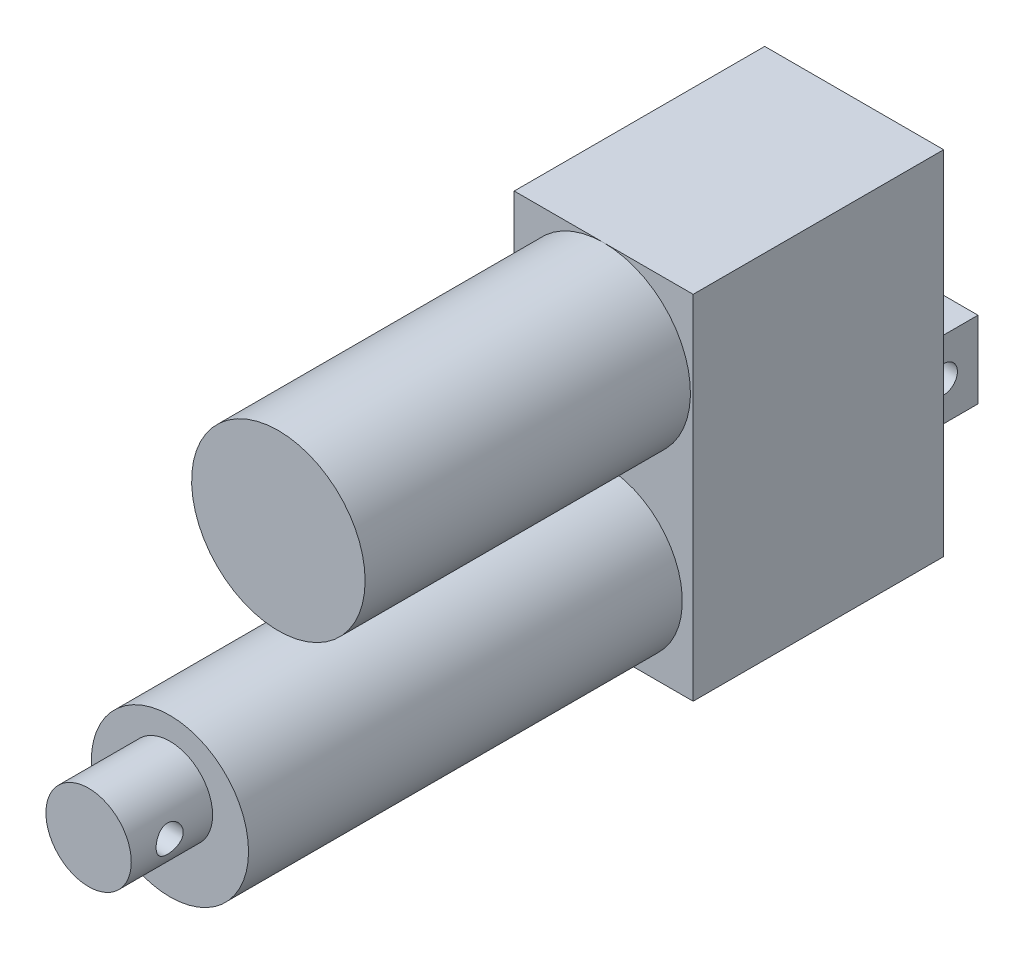
ISO-10303-21;
HEADER;
FILE_DESCRIPTION(('STEP AP214'),'2;1');
FILE_NAME('part.step','',(''),(''),'','','');
FILE_SCHEMA(('AUTOMOTIVE_DESIGN { 1 0 10303 214 1 1 1 1 }'));
ENDSEC;
DATA;
#1=APPLICATION_CONTEXT('core data for automotive mechanical design processes');
#2=APPLICATION_PROTOCOL_DEFINITION('international standard','automotive_design',2000,#1);
#3=PRODUCT_CONTEXT('',#1,'mechanical');
#4=PRODUCT('Part','Part','',(#3));
#5=PRODUCT_RELATED_PRODUCT_CATEGORY('part','',(#4));
#6=PRODUCT_DEFINITION_FORMATION('','',#4);
#7=PRODUCT_DEFINITION_CONTEXT('part definition',#1,'design');
#8=PRODUCT_DEFINITION('design','',#6,#7);
#9=PRODUCT_DEFINITION_SHAPE('','',#8);
#10=(LENGTH_UNIT() NAMED_UNIT(*) SI_UNIT(.MILLI.,.METRE.));
#11=(NAMED_UNIT(*) PLANE_ANGLE_UNIT() SI_UNIT($,.RADIAN.));
#12=(NAMED_UNIT(*) SI_UNIT($,.STERADIAN.) SOLID_ANGLE_UNIT());
#13=UNCERTAINTY_MEASURE_WITH_UNIT(LENGTH_MEASURE(1.E-05),#10,'distance_accuracy_value','');
#14=(GEOMETRIC_REPRESENTATION_CONTEXT(3) GLOBAL_UNCERTAINTY_ASSIGNED_CONTEXT((#13)) GLOBAL_UNIT_ASSIGNED_CONTEXT((#10,
#11,#12)) REPRESENTATION_CONTEXT('',''));
#15=CARTESIAN_POINT('',(0.,0.,0.));
#16=DIRECTION('',(0.,0.,1.));
#17=DIRECTION('',(1.,0.,0.));
#18=AXIS2_PLACEMENT_3D('',#15,#16,#17);
#19=CARTESIAN_POINT('',(0.,0.,0.));
#20=DIRECTION('',(0.,0.,-1.));
#21=DIRECTION('',(-1.,0.,0.));
#22=AXIS2_PLACEMENT_3D('',#19,#20,#21);
#23=PLANE('',#22);
#24=DIRECTION('',(0.,-1.,0.));
#25=VECTOR('',#24,1.);
#26=CARTESIAN_POINT('',(-20.955,0.,0.));
#27=LINE('',#26,#25);
#28=CARTESIAN_POINT('',(-20.955,82.55,0.));
#29=VERTEX_POINT('',#28);
#30=CARTESIAN_POINT('',(-20.955,0.,0.));
#31=VERTEX_POINT('',#30);
#32=EDGE_CURVE('E172',#29,#31,#27,.T.);
#33=ORIENTED_EDGE('',*,*,#32,.F.);
#34=DIRECTION('',(-1.,0.,0.));
#35=VECTOR('',#34,1.);
#36=CARTESIAN_POINT('',(-20.955,82.55,0.));
#37=LINE('',#36,#35);
#38=CARTESIAN_POINT('',(20.955,82.55,0.));
#39=VERTEX_POINT('',#38);
#40=EDGE_CURVE('E88',#39,#29,#37,.T.);
#41=ORIENTED_EDGE('',*,*,#40,.F.);
#42=DIRECTION('',(0.,1.,0.));
#43=VECTOR('',#42,1.);
#44=CARTESIAN_POINT('',(20.955,0.,0.));
#45=LINE('',#44,#43);
#46=CARTESIAN_POINT('',(20.955,0.,0.));
#47=VERTEX_POINT('',#46);
#48=EDGE_CURVE('E194',#47,#39,#45,.T.);
#49=ORIENTED_EDGE('',*,*,#48,.F.);
#50=DIRECTION('',(1.,0.,0.));
#51=VECTOR('',#50,1.);
#52=CARTESIAN_POINT('',(-20.955,0.,0.));
#53=LINE('',#52,#51);
#54=EDGE_CURVE('E191',#31,#47,#53,.T.);
#55=ORIENTED_EDGE('',*,*,#54,.F.);
#56=EDGE_LOOP('',(#33,#41,#49,#55));
#57=FACE_BOUND('',#56,.T.);
#58=DIRECTION('',(-1.,0.,0.));
#59=VECTOR('',#58,1.);
#60=CARTESIAN_POINT('',(9.,15.,0.));
#61=LINE('',#60,#59);
#62=CARTESIAN_POINT('',(9.,15.,0.));
#63=VERTEX_POINT('',#62);
#64=CARTESIAN_POINT('',(-9.,15.,0.));
#65=VERTEX_POINT('',#64);
#66=EDGE_CURVE('E388',#63,#65,#61,.T.);
#67=ORIENTED_EDGE('',*,*,#66,.F.);
#68=DIRECTION('',(0.,-1.,0.));
#69=VECTOR('',#68,1.);
#70=CARTESIAN_POINT('',(9.,15.,0.));
#71=LINE('',#70,#69);
#72=CARTESIAN_POINT('',(9.,33.,0.));
#73=VERTEX_POINT('',#72);
#74=EDGE_CURVE('E146',#73,#63,#71,.T.);
#75=ORIENTED_EDGE('',*,*,#74,.F.);
#76=DIRECTION('',(1.,0.,0.));
#77=VECTOR('',#76,1.);
#78=CARTESIAN_POINT('',(9.,33.,0.));
#79=LINE('',#78,#77);
#80=CARTESIAN_POINT('',(-9.,33.,0.));
#81=VERTEX_POINT('',#80);
#82=EDGE_CURVE('E142',#81,#73,#79,.T.);
#83=ORIENTED_EDGE('',*,*,#82,.F.);
#84=DIRECTION('',(0.,1.,0.));
#85=VECTOR('',#84,1.);
#86=CARTESIAN_POINT('',(-9.,15.,0.));
#87=LINE('',#86,#85);
#88=EDGE_CURVE('E398',#65,#81,#87,.T.);
#89=ORIENTED_EDGE('',*,*,#88,.F.);
#90=EDGE_LOOP('',(#67,#75,#83,#89));
#91=FACE_BOUND('',#90,.T.);
#92=ADVANCED_FACE('F39',(#57,#91),#23,.T.);
#93=CARTESIAN_POINT('',(0.,22.225,179.324));
#94=DIRECTION('',(0.,0.,-1.));
#95=DIRECTION('',(-1.,0.,0.));
#96=AXIS2_PLACEMENT_3D('',#93,#94,#95);
#97=CYLINDRICAL_SURFACE('',#96,9.9949);
#98=CARTESIAN_POINT('',(0.,22.225,179.324));
#99=DIRECTION('',(0.,0.,1.));
#100=DIRECTION('',(1.,0.,0.));
#101=AXIS2_PLACEMENT_3D('',#98,#99,#100);
#102=CIRCLE('',#101,9.9949);
#103=CARTESIAN_POINT('',(9.9949,22.225,179.324));
#104=VERTEX_POINT('',#103);
#105=EDGE_CURVE('E159',#104,#104,#102,.T.);
#106=ORIENTED_EDGE('',*,*,#105,.F.);
#107=EDGE_LOOP('',(#106));
#108=FACE_BOUND('',#107,.T.);
#109=CARTESIAN_POINT('',(0.,22.225,160.274));
#110=DIRECTION('',(0.,0.,1.));
#111=DIRECTION('',(1.,0.,0.));
#112=AXIS2_PLACEMENT_3D('',#109,#110,#111);
#113=CIRCLE('',#112,9.9949);
#114=CARTESIAN_POINT('',(9.9949,22.225,160.274));
#115=VERTEX_POINT('',#114);
#116=EDGE_CURVE('E11',#115,#115,#113,.T.);
#117=ORIENTED_EDGE('',*,*,#116,.T.);
#118=EDGE_LOOP('',(#117));
#119=FACE_BOUND('',#118,.T.);
#120=CARTESIAN_POINT('',(9.9949,22.225,173.499));
#121=CARTESIAN_POINT('',(9.99489943148129,22.0513092565541,173.498999308142));
#122=CARTESIAN_POINT('',(9.99032991919589,21.8776106581891,173.484700347904));
#123=CARTESIAN_POINT('',(9.97254948420157,21.5353020847592,173.428038276044));
#124=CARTESIAN_POINT('',(9.95933686556654,21.366693115161,173.385669656652));
#125=CARTESIAN_POINT('',(9.92571173869561,21.0395490634003,173.274447608853));
#126=CARTESIAN_POINT('',(9.9053105975343,20.8809985404042,173.205635978803));
#127=CARTESIAN_POINT('',(9.85940898949097,20.5776867487244,173.043661755274));
#128=CARTESIAN_POINT('',(9.83390766824858,20.4329277963521,172.950495081136));
#129=CARTESIAN_POINT('',(9.77959994972423,20.1567043589147,172.739338335955));
#130=CARTESIAN_POINT('',(9.75071977661289,20.0257397862073,172.620713363377));
#131=CARTESIAN_POINT('',(9.69333136472951,19.7851892652354,172.363358676787));
#132=CARTESIAN_POINT('',(9.66482319915058,19.6756074666071,172.224625069491));
#133=CARTESIAN_POINT('',(9.61061015099939,19.4781880893728,171.926621763452));
#134=CARTESIAN_POINT('',(9.5849960523083,19.3909811386147,171.766916201589));
#135=CARTESIAN_POINT('',(9.54058383031433,19.2448724733884,171.434160724684));
#136=CARTESIAN_POINT('',(9.52178384371333,19.1859630196209,171.261114473333));
#137=CARTESIAN_POINT('',(9.49390138743546,19.0999620328589,170.912241952035));
#138=CARTESIAN_POINT('',(9.48453576169181,19.0719408227374,170.736668128251));
#139=CARTESIAN_POINT('',(9.47574247746716,19.0456067989369,170.383080625228));
#140=CARTESIAN_POINT('',(9.47631207537939,19.0472857835666,170.205067633132));
#141=CARTESIAN_POINT('',(9.48707537595335,19.0795786493489,169.859401861761));
#142=CARTESIAN_POINT('',(9.49687349324131,19.1090032583698,169.691623570946));
#143=CARTESIAN_POINT('',(9.52434606300262,19.1940210056623,169.363520722026));
#144=CARTESIAN_POINT('',(9.54202137801414,19.2496170096894,169.203196982303));
#145=CARTESIAN_POINT('',(9.58355473647211,19.3862241866953,168.891753069181));
#146=CARTESIAN_POINT('',(9.6075014418426,19.4676036493509,168.740806769172));
#147=CARTESIAN_POINT('',(9.65883961396201,19.6532119521148,168.454325776801));
#148=CARTESIAN_POINT('',(9.68623199955546,19.7574468925241,168.318795213712));
#149=CARTESIAN_POINT('',(9.74295467384294,19.991613078832,168.06027909095));
#150=CARTESIAN_POINT('',(9.77231545128488,20.1225238524278,167.938185808921));
#151=CARTESIAN_POINT('',(9.82853033884383,20.4033267685916,167.717464879223));
#152=CARTESIAN_POINT('',(9.85538425058315,20.5532204111372,167.618839087669));
#153=CARTESIAN_POINT('',(9.90385804044438,20.8694954466435,167.447221043123));
#154=CARTESIAN_POINT('',(9.92543270832616,21.0360031590969,167.374447948131));
#155=CARTESIAN_POINT('',(9.96059040611695,21.3797429795963,167.258212390363));
#156=CARTESIAN_POINT('',(9.97417594671657,21.556971699091,167.214740718594));
#157=CARTESIAN_POINT('',(9.99141776666915,21.9095536655364,167.159876653046));
#158=CARTESIAN_POINT('',(9.99544754891065,22.0847010423518,167.1472768878));
#159=CARTESIAN_POINT('',(9.99423222033593,22.4346298116178,167.151101608856));
#160=CARTESIAN_POINT('',(9.98898851468274,22.6094112554986,167.167521697931));
#161=CARTESIAN_POINT('',(9.97006114580803,22.9489473033509,167.227953940954));
#162=CARTESIAN_POINT('',(9.95659906175966,23.1138442971088,167.271242186709));
#163=CARTESIAN_POINT('',(9.92281793169894,23.4339841156978,167.383293376658));
#164=CARTESIAN_POINT('',(9.90249803083972,23.5892257340996,167.452059496847));
#165=CARTESIAN_POINT('',(9.85645540380041,23.8899454675883,167.615023043681));
#166=CARTESIAN_POINT('',(9.830610853814,24.0350846502555,167.709810532897));
#167=CARTESIAN_POINT('',(9.77646850305318,24.3077990050254,167.921421896696));
#168=CARTESIAN_POINT('',(9.74817001724959,24.435369246776,168.038251935344));
#169=CARTESIAN_POINT('',(9.69084521531567,24.6747613337025,168.296311806585));
#170=CARTESIAN_POINT('',(9.66183667735056,24.7857222355353,168.438346099243));
#171=CARTESIAN_POINT('',(9.60758324297748,24.9823187549957,168.739648133735));
#172=CARTESIAN_POINT('',(9.58233830613342,25.0679546447247,168.898915690383));
#173=CARTESIAN_POINT('',(9.5387440009466,25.2109659471571,169.229920713115));
#174=CARTESIAN_POINT('',(9.52037069133432,25.268439700184,169.401612348826));
#175=CARTESIAN_POINT('',(9.49278210042133,25.353442097597,169.752943612579));
#176=CARTESIAN_POINT('',(9.48356318317802,25.3809826312739,169.932580055465));
#177=CARTESIAN_POINT('',(9.47571459120659,25.4044646008111,170.285677108272));
#178=CARTESIAN_POINT('',(9.47661027899982,25.4018223239037,170.45903411663));
#179=CARTESIAN_POINT('',(9.48773196247542,25.3684488244648,170.802702481114));
#180=CARTESIAN_POINT('',(9.49795749531317,25.3377189953294,170.973013987898));
#181=CARTESIAN_POINT('',(9.52624962207743,25.2500044549944,171.303131460969));
#182=CARTESIAN_POINT('',(9.54419107692458,25.1934378990353,171.463060076378));
#183=CARTESIAN_POINT('',(9.58585794733052,25.0559869327322,171.77128321614));
#184=CARTESIAN_POINT('',(9.60958456686964,24.9750974596025,171.919575310256));
#185=CARTESIAN_POINT('',(9.66133936280518,24.787492070229,172.206777493647));
#186=CARTESIAN_POINT('',(9.68950221367301,24.6798678841986,172.345069933897));
#187=CARTESIAN_POINT('',(9.74635077808078,24.4434310053527,172.602090157918));
#188=CARTESIAN_POINT('',(9.77503663146558,24.3146125693064,172.720812621099));
#189=CARTESIAN_POINT('',(9.830874311614,24.0341540229892,172.939387889396));
#190=CARTESIAN_POINT('',(9.85794031399361,23.8818848505993,173.038457967956));
#191=CARTESIAN_POINT('',(9.90639070684724,23.5619961410756,173.209468516074));
#192=CARTESIAN_POINT('',(9.92777714553556,23.3943821671233,173.281418769757));
#193=CARTESIAN_POINT('',(9.96112964795618,23.0615237977346,173.39144854967));
#194=CARTESIAN_POINT('',(9.97368125683868,22.8970420072601,173.43166111847));
#195=CARTESIAN_POINT('',(9.99056581075465,22.5633752708453,173.485434265252));
#196=CARTESIAN_POINT('',(9.99490055379149,22.3941913620396,173.499000673936));
#197=CARTESIAN_POINT('',(9.9949,22.225,173.499));
#198=B_SPLINE_CURVE_WITH_KNOTS('',3,(#120,#121,#122,#123,#124,#125,#126,#127,#128,#129,#130,
#131,#132,#133,#134,#135,#136,#137,#138,#139,#140,#141,#142,#143,#144,#145,#146,#147,#148,#149,
#150,#151,#152,#153,#154,#155,#156,#157,#158,#159,#160,#161,#162,#163,#164,#165,#166,#167,#168,
#169,#170,#171,#172,#173,#174,#175,#176,#177,#178,#179,#180,#181,#182,#183,#184,#185,#186,#187,
#188,#189,#190,#191,#192,#193,#194,#195,#196,#197),.UNSPECIFIED.,.T.,.F.,(4,2,2,2,2,2,2,2,2,2,2,
2,2,2,2,2,2,2,2,2,2,2,2,2,2,2,2,2,2,2,2,2,2,2,2,2,2,2,4),(0.,0.52045016251978,1.04100247695617,
1.56073531880923,2.0805552971219,2.6152730405478,3.15009445069503,3.69864951197175,
4.24705445917616,4.77846014649094,5.30971908872857,5.81919423976349,6.3287251910694,
6.84588990746844,7.36319282745791,7.90487595100089,8.44660190369042,8.99281634075519,
9.5388590307312,10.0631791987438,10.5874199260755,11.0981149098594,11.6088735767893,
12.1323375728691,12.6559481700261,13.2010430515873,13.7461320762328,14.2893038753472,
14.832259851031,15.3498472079274,15.8674088892094,16.3768756761892,16.8864485815534,
17.4165265584337,17.946748413463,18.4950748080163,19.0432031909209,19.5502822947828,
20.0572504274735),.UNSPECIFIED.);
#199=CARTESIAN_POINT('',(9.9949,22.225,173.499));
#200=VERTEX_POINT('',#199);
#201=EDGE_CURVE('E149',#200,#200,#198,.T.);
#202=ORIENTED_EDGE('',*,*,#201,.F.);
#203=EDGE_LOOP('',(#202));
#204=FACE_BOUND('',#203,.T.);
#205=CARTESIAN_POINT('',(-9.9949,22.225,173.499));
#206=CARTESIAN_POINT('',(-9.99489943148129,22.3986907434459,173.498999308142));
#207=CARTESIAN_POINT('',(-9.99032991919589,22.5723893418109,173.484700347904));
#208=CARTESIAN_POINT('',(-9.97254948420157,22.9146979152408,173.428038276044));
#209=CARTESIAN_POINT('',(-9.95933686556654,23.083306884839,173.385669656652));
#210=CARTESIAN_POINT('',(-9.92571173869561,23.4104509365997,173.274447608853));
#211=CARTESIAN_POINT('',(-9.9053105975343,23.5690014595958,173.205635978803));
#212=CARTESIAN_POINT('',(-9.85940898949097,23.8723132512756,173.043661755274));
#213=CARTESIAN_POINT('',(-9.83390766824858,24.0170722036479,172.950495081136));
#214=CARTESIAN_POINT('',(-9.77959994972423,24.2932956410853,172.739338335955));
#215=CARTESIAN_POINT('',(-9.75071977661289,24.4242602137927,172.620713363377));
#216=CARTESIAN_POINT('',(-9.69333136472951,24.6648107347646,172.363358676787));
#217=CARTESIAN_POINT('',(-9.66482319915058,24.7743925333928,172.224625069491));
#218=CARTESIAN_POINT('',(-9.61061015099939,24.9718119106272,171.926621763452));
#219=CARTESIAN_POINT('',(-9.5849960523083,25.0590188613853,171.766916201589));
#220=CARTESIAN_POINT('',(-9.54058383031433,25.2051275266116,171.434160724684));
#221=CARTESIAN_POINT('',(-9.52178384371333,25.2640369803791,171.261114473333));
#222=CARTESIAN_POINT('',(-9.49390138743546,25.3500379671411,170.912241952035));
#223=CARTESIAN_POINT('',(-9.48453576169181,25.3780591772626,170.736668128251));
#224=CARTESIAN_POINT('',(-9.47574247746716,25.4043932010631,170.383080625228));
#225=CARTESIAN_POINT('',(-9.47631207537939,25.4027142164334,170.205067633132));
#226=CARTESIAN_POINT('',(-9.48707537595335,25.3704213506511,169.859401861761));
#227=CARTESIAN_POINT('',(-9.49687349324131,25.3409967416302,169.691623570946));
#228=CARTESIAN_POINT('',(-9.52434606300262,25.2559789943377,169.363520722026));
#229=CARTESIAN_POINT('',(-9.54202137801414,25.2003829903106,169.203196982303));
#230=CARTESIAN_POINT('',(-9.58355473647211,25.0637758133047,168.891753069181));
#231=CARTESIAN_POINT('',(-9.6075014418426,24.9823963506491,168.740806769172));
#232=CARTESIAN_POINT('',(-9.65883961396201,24.7967880478852,168.454325776801));
#233=CARTESIAN_POINT('',(-9.68623199955546,24.6925531074759,168.318795213712));
#234=CARTESIAN_POINT('',(-9.74295467384294,24.458386921168,168.06027909095));
#235=CARTESIAN_POINT('',(-9.77231545128488,24.3274761475722,167.938185808921));
#236=CARTESIAN_POINT('',(-9.82853033884383,24.0466732314084,167.717464879223));
#237=CARTESIAN_POINT('',(-9.85538425058315,23.8967795888628,167.618839087669));
#238=CARTESIAN_POINT('',(-9.90385804044438,23.5805045533565,167.447221043123));
#239=CARTESIAN_POINT('',(-9.92543270832616,23.4139968409031,167.374447948131));
#240=CARTESIAN_POINT('',(-9.96059040611695,23.0702570204037,167.258212390363));
#241=CARTESIAN_POINT('',(-9.97417594671657,22.893028300909,167.214740718594));
#242=CARTESIAN_POINT('',(-9.99141776666915,22.5404463344636,167.159876653046));
#243=CARTESIAN_POINT('',(-9.99544754891065,22.3652989576482,167.1472768878));
#244=CARTESIAN_POINT('',(-9.99423222033593,22.0153701883822,167.151101608856));
#245=CARTESIAN_POINT('',(-9.98898851468274,21.8405887445014,167.167521697931));
#246=CARTESIAN_POINT('',(-9.97006114580803,21.5010526966491,167.227953940954));
#247=CARTESIAN_POINT('',(-9.95659906175966,21.3361557028912,167.271242186709));
#248=CARTESIAN_POINT('',(-9.92281793169894,21.0160158843022,167.383293376658));
#249=CARTESIAN_POINT('',(-9.90249803083972,20.8607742659004,167.452059496847));
#250=CARTESIAN_POINT('',(-9.85645540380041,20.5600545324117,167.615023043681));
#251=CARTESIAN_POINT('',(-9.830610853814,20.4149153497445,167.709810532897));
#252=CARTESIAN_POINT('',(-9.77646850305318,20.1422009949746,167.921421896696));
#253=CARTESIAN_POINT('',(-9.74817001724959,20.014630753224,168.038251935344));
#254=CARTESIAN_POINT('',(-9.69084521531567,19.7752386662974,168.296311806585));
#255=CARTESIAN_POINT('',(-9.66183667735056,19.6642777644647,168.438346099243));
#256=CARTESIAN_POINT('',(-9.60758324297748,19.4676812450043,168.739648133735));
#257=CARTESIAN_POINT('',(-9.58233830613342,19.3820453552753,168.898915690383));
#258=CARTESIAN_POINT('',(-9.5387440009466,19.2390340528429,169.229920713115));
#259=CARTESIAN_POINT('',(-9.52037069133432,19.181560299816,169.401612348826));
#260=CARTESIAN_POINT('',(-9.49278210042133,19.096557902403,169.752943612579));
#261=CARTESIAN_POINT('',(-9.48356318317802,19.0690173687261,169.932580055465));
#262=CARTESIAN_POINT('',(-9.47571459120659,19.0455353991889,170.285677108272));
#263=CARTESIAN_POINT('',(-9.47661027899982,19.0481776760963,170.45903411663));
#264=CARTESIAN_POINT('',(-9.48773196247542,19.0815511755352,170.802702481114));
#265=CARTESIAN_POINT('',(-9.49795749531317,19.1122810046706,170.973013987898));
#266=CARTESIAN_POINT('',(-9.52624962207743,19.1999955450056,171.303131460969));
#267=CARTESIAN_POINT('',(-9.54419107692458,19.2565621009647,171.463060076378));
#268=CARTESIAN_POINT('',(-9.58585794733052,19.3940130672678,171.77128321614));
#269=CARTESIAN_POINT('',(-9.60958456686964,19.4749025403975,171.919575310256));
#270=CARTESIAN_POINT('',(-9.66133936280517,19.662507929771,172.206777493647));
#271=CARTESIAN_POINT('',(-9.68950221367301,19.7701321158014,172.345069933897));
#272=CARTESIAN_POINT('',(-9.74635077808078,20.0065689946473,172.602090157918));
#273=CARTESIAN_POINT('',(-9.77503663146558,20.1353874306936,172.720812621099));
#274=CARTESIAN_POINT('',(-9.830874311614,20.4158459770108,172.939387889396));
#275=CARTESIAN_POINT('',(-9.85794031399361,20.5681151494007,173.038457967956));
#276=CARTESIAN_POINT('',(-9.90639070684724,20.8880038589243,173.209468516074));
#277=CARTESIAN_POINT('',(-9.92777714553556,21.0556178328767,173.281418769757));
#278=CARTESIAN_POINT('',(-9.96112964795618,21.3884762022654,173.39144854967));
#279=CARTESIAN_POINT('',(-9.97368125683868,21.5529579927399,173.43166111847));
#280=CARTESIAN_POINT('',(-9.99056581075465,21.8866247291547,173.485434265252));
#281=CARTESIAN_POINT('',(-9.99490055379149,22.0558086379604,173.499000673936));
#282=CARTESIAN_POINT('',(-9.9949,22.225,173.499));
#283=B_SPLINE_CURVE_WITH_KNOTS('',3,(#205,#206,#207,#208,#209,#210,#211,#212,#213,#214,#215,
#216,#217,#218,#219,#220,#221,#222,#223,#224,#225,#226,#227,#228,#229,#230,#231,#232,#233,#234,
#235,#236,#237,#238,#239,#240,#241,#242,#243,#244,#245,#246,#247,#248,#249,#250,#251,#252,#253,
#254,#255,#256,#257,#258,#259,#260,#261,#262,#263,#264,#265,#266,#267,#268,#269,#270,#271,#272,
#273,#274,#275,#276,#277,#278,#279,#280,#281,#282),.UNSPECIFIED.,.T.,.F.,(4,2,2,2,2,2,2,2,2,2,2,
2,2,2,2,2,2,2,2,2,2,2,2,2,2,2,2,2,2,2,2,2,2,2,2,2,2,2,4),(0.,0.52045016251978,1.04100247695617,
1.56073531880923,2.0805552971219,2.61527304054781,3.15009445069504,3.69864951197175,
4.24705445917616,4.77846014649094,5.30971908872857,5.81919423976349,6.3287251910694,
6.84588990746844,7.36319282745791,7.90487595100089,8.44660190369042,8.99281634075519,
9.5388590307312,10.0631791987438,10.5874199260755,11.0981149098594,11.6088735767893,
12.1323375728691,12.6559481700261,13.2010430515873,13.7461320762328,14.2893038753472,
14.832259851031,15.3498472079274,15.8674088892094,16.3768756761892,16.8864485815534,
17.4165265584337,17.946748413463,18.4950748080163,19.0432031909209,19.5502822947828,
20.0572504274735),.UNSPECIFIED.);
#284=CARTESIAN_POINT('',(-9.9949,22.225,173.499));
#285=VERTEX_POINT('',#284);
#286=EDGE_CURVE('E154',#285,#285,#283,.T.);
#287=ORIENTED_EDGE('',*,*,#286,.F.);
#288=EDGE_LOOP('',(#287));
#289=FACE_BOUND('',#288,.T.);
#290=ADVANCED_FACE('F221',(#108,#119,#204,#289),#97,.T.);
#291=CARTESIAN_POINT('',(-20.955,0.,58.674));
#292=DIRECTION('',(1.,0.,0.));
#293=DIRECTION('',(0.,0.,-1.));
#294=AXIS2_PLACEMENT_3D('',#291,#292,#293);
#295=PLANE('',#294);
#296=ORIENTED_EDGE('',*,*,#32,.T.);
#297=DIRECTION('',(0.,0.,-1.));
#298=VECTOR('',#297,1.);
#299=CARTESIAN_POINT('',(-20.955,0.,58.674));
#300=LINE('',#299,#298);
#301=CARTESIAN_POINT('',(-20.955,0.,58.674));
#302=VERTEX_POINT('',#301);
#303=EDGE_CURVE('E208',#302,#31,#300,.T.);
#304=ORIENTED_EDGE('',*,*,#303,.F.);
#305=DIRECTION('',(0.,-1.,0.));
#306=VECTOR('',#305,1.);
#307=CARTESIAN_POINT('',(-20.955,0.,58.674));
#308=LINE('',#307,#306);
#309=CARTESIAN_POINT('',(-20.955,82.55,58.674));
#310=VERTEX_POINT('',#309);
#311=EDGE_CURVE('E176',#310,#302,#308,.T.);
#312=ORIENTED_EDGE('',*,*,#311,.F.);
#313=DIRECTION('',(0.,0.,-1.));
#314=VECTOR('',#313,1.);
#315=CARTESIAN_POINT('',(-20.955,82.55,58.674));
#316=LINE('',#315,#314);
#317=EDGE_CURVE('E187',#310,#29,#316,.T.);
#318=ORIENTED_EDGE('',*,*,#317,.T.);
#319=EDGE_LOOP('',(#296,#304,#312,#318));
#320=FACE_BOUND('',#319,.T.);
#321=ADVANCED_FACE('F41',(#320),#295,.F.);
#322=CARTESIAN_POINT('',(-20.955,0.,58.674));
#323=DIRECTION('',(0.,1.,0.));
#324=DIRECTION('',(0.,0.,1.));
#325=AXIS2_PLACEMENT_3D('',#322,#323,#324);
#326=PLANE('',#325);
#327=ORIENTED_EDGE('',*,*,#54,.T.);
#328=DIRECTION('',(0.,0.,-1.));
#329=VECTOR('',#328,1.);
#330=CARTESIAN_POINT('',(20.955,0.,58.674));
#331=LINE('',#330,#329);
#332=CARTESIAN_POINT('',(20.955,0.,58.674));
#333=VERTEX_POINT('',#332);
#334=EDGE_CURVE('E204',#333,#47,#331,.T.);
#335=ORIENTED_EDGE('',*,*,#334,.F.);
#336=DIRECTION('',(1.,0.,0.));
#337=VECTOR('',#336,1.);
#338=CARTESIAN_POINT('',(-20.955,0.,58.674));
#339=LINE('',#338,#337);
#340=EDGE_CURVE('E96',#302,#333,#339,.T.);
#341=ORIENTED_EDGE('',*,*,#340,.F.);
#342=ORIENTED_EDGE('',*,*,#303,.T.);
#343=EDGE_LOOP('',(#327,#335,#341,#342));
#344=FACE_BOUND('',#343,.T.);
#345=ADVANCED_FACE('F259',(#344),#326,.F.);
#346=CARTESIAN_POINT('',(20.955,0.,58.674));
#347=DIRECTION('',(-1.,0.,0.));
#348=DIRECTION('',(0.,0.,1.));
#349=AXIS2_PLACEMENT_3D('',#346,#347,#348);
#350=PLANE('',#349);
#351=ORIENTED_EDGE('',*,*,#48,.T.);
#352=DIRECTION('',(0.,0.,-1.));
#353=VECTOR('',#352,1.);
#354=CARTESIAN_POINT('',(20.955,82.55,58.674));
#355=LINE('',#354,#353);
#356=CARTESIAN_POINT('',(20.955,82.55,58.674));
#357=VERTEX_POINT('',#356);
#358=EDGE_CURVE('E201',#357,#39,#355,.T.);
#359=ORIENTED_EDGE('',*,*,#358,.F.);
#360=DIRECTION('',(0.,1.,0.));
#361=VECTOR('',#360,1.);
#362=CARTESIAN_POINT('',(20.955,0.,58.674));
#363=LINE('',#362,#361);
#364=EDGE_CURVE('E181',#333,#357,#363,.T.);
#365=ORIENTED_EDGE('',*,*,#364,.F.);
#366=ORIENTED_EDGE('',*,*,#334,.T.);
#367=EDGE_LOOP('',(#351,#359,#365,#366));
#368=FACE_BOUND('',#367,.T.);
#369=ADVANCED_FACE('F257',(#368),#350,.F.);
#370=CARTESIAN_POINT('',(-20.955,82.55,58.674));
#371=DIRECTION('',(0.,-1.,0.));
#372=DIRECTION('',(0.,0.,-1.));
#373=AXIS2_PLACEMENT_3D('',#370,#371,#372);
#374=PLANE('',#373);
#375=ORIENTED_EDGE('',*,*,#40,.T.);
#376=ORIENTED_EDGE('',*,*,#317,.F.);
#377=DIRECTION('',(-1.,0.,0.));
#378=VECTOR('',#377,1.);
#379=CARTESIAN_POINT('',(-20.955,82.55,58.674));
#380=LINE('',#379,#378);
#381=CARTESIAN_POINT('',(0.,82.55,58.674));
#382=VERTEX_POINT('',#381);
#383=EDGE_CURVE('E66',#382,#310,#380,.T.);
#384=ORIENTED_EDGE('',*,*,#383,.F.);
#385=EDGE_CURVE('E184',#357,#382,#380,.T.);
#386=ORIENTED_EDGE('',*,*,#385,.F.);
#387=ORIENTED_EDGE('',*,*,#358,.T.);
#388=EDGE_LOOP('',(#375,#376,#384,#386,#387));
#389=FACE_BOUND('',#388,.T.);
#390=ADVANCED_FACE('F254',(#389),#374,.F.);
#391=CARTESIAN_POINT('',(0.,0.,58.674));
#392=DIRECTION('',(0.,0.,-1.));
#393=DIRECTION('',(-1.,0.,0.));
#394=AXIS2_PLACEMENT_3D('',#391,#392,#393);
#395=PLANE('',#394);
#396=CARTESIAN_POINT('',(0.,19.05,58.674));
#397=DIRECTION('',(0.,0.,-1.));
#398=DIRECTION('',(-1.,0.,0.));
#399=AXIS2_PLACEMENT_3D('',#396,#397,#398);
#400=CIRCLE('',#399,18.415);
#401=CARTESIAN_POINT('',(-18.415,19.05,58.674));
#402=VERTEX_POINT('',#401);
#403=EDGE_CURVE('E49',#402,#402,#400,.F.);
#404=ORIENTED_EDGE('',*,*,#403,.F.);
#405=EDGE_LOOP('',(#404));
#406=FACE_BOUND('',#405,.T.);
#407=ORIENTED_EDGE('',*,*,#385,.T.);
#408=CARTESIAN_POINT('',(0.,62.23,58.674));
#409=DIRECTION('',(0.,0.,1.));
#410=DIRECTION('',(1.,0.,0.));
#411=AXIS2_PLACEMENT_3D('',#408,#409,#410);
#412=CIRCLE('',#411,20.32);
#413=EDGE_CURVE('E167',#382,#382,#412,.T.);
#414=ORIENTED_EDGE('',*,*,#413,.F.);
#415=ORIENTED_EDGE('',*,*,#383,.T.);
#416=ORIENTED_EDGE('',*,*,#311,.T.);
#417=ORIENTED_EDGE('',*,*,#340,.T.);
#418=ORIENTED_EDGE('',*,*,#364,.T.);
#419=EDGE_LOOP('',(#407,#414,#415,#416,#417,#418));
#420=FACE_BOUND('',#419,.T.);
#421=ADVANCED_FACE('F252',(#406,#420),#395,.F.);
#422=CARTESIAN_POINT('',(0.,62.23,134.874));
#423=DIRECTION('',(0.,0.,-1.));
#424=DIRECTION('',(-1.,0.,0.));
#425=AXIS2_PLACEMENT_3D('',#422,#423,#424);
#426=CYLINDRICAL_SURFACE('',#425,20.32);
#427=CARTESIAN_POINT('',(0.,62.23,134.874));
#428=DIRECTION('',(0.,0.,1.));
#429=DIRECTION('',(1.,0.,0.));
#430=AXIS2_PLACEMENT_3D('',#427,#428,#429);
#431=CIRCLE('',#430,20.32);
#432=CARTESIAN_POINT('',(20.32,62.23,134.874));
#433=VERTEX_POINT('',#432);
#434=EDGE_CURVE('E168',#433,#433,#431,.T.);
#435=ORIENTED_EDGE('',*,*,#434,.F.);
#436=EDGE_LOOP('',(#435));
#437=FACE_BOUND('',#436,.T.);
#438=ORIENTED_EDGE('',*,*,#413,.T.);
#439=EDGE_LOOP('',(#438));
#440=FACE_BOUND('',#439,.T.);
#441=ADVANCED_FACE('F274',(#437,#440),#426,.T.);
#442=CARTESIAN_POINT('',(0.,62.23,134.874));
#443=DIRECTION('',(0.,0.,1.));
#444=DIRECTION('',(1.,0.,0.));
#445=AXIS2_PLACEMENT_3D('',#442,#443,#444);
#446=PLANE('',#445);
#447=ORIENTED_EDGE('',*,*,#434,.T.);
#448=EDGE_LOOP('',(#447));
#449=FACE_BOUND('',#448,.T.);
#450=ADVANCED_FACE('F276',(#449),#446,.T.);
#451=CARTESIAN_POINT('',(0.,19.05,160.274));
#452=DIRECTION('',(0.,0.,-1.));
#453=DIRECTION('',(-1.,0.,0.));
#454=AXIS2_PLACEMENT_3D('',#451,#452,#453);
#455=CYLINDRICAL_SURFACE('',#454,18.415);
#456=CARTESIAN_POINT('',(0.,19.05,160.274));
#457=DIRECTION('',(0.,0.,1.));
#458=DIRECTION('',(1.,0.,0.));
#459=AXIS2_PLACEMENT_3D('',#456,#457,#458);
#460=CIRCLE('',#459,18.415);
#461=CARTESIAN_POINT('',(18.415,19.05,160.274));
#462=VERTEX_POINT('',#461);
#463=EDGE_CURVE('E162',#462,#462,#460,.T.);
#464=ORIENTED_EDGE('',*,*,#463,.F.);
#465=EDGE_LOOP('',(#464));
#466=FACE_BOUND('',#465,.T.);
#467=ORIENTED_EDGE('',*,*,#403,.T.);
#468=EDGE_LOOP('',(#467));
#469=FACE_BOUND('',#468,.T.);
#470=ADVANCED_FACE('F239',(#466,#469),#455,.T.);
#471=CARTESIAN_POINT('',(0.,19.05,160.274));
#472=DIRECTION('',(0.,0.,1.));
#473=DIRECTION('',(1.,0.,0.));
#474=AXIS2_PLACEMENT_3D('',#471,#472,#473);
#475=PLANE('',#474);
#476=ORIENTED_EDGE('',*,*,#116,.F.);
#477=EDGE_LOOP('',(#476));
#478=FACE_BOUND('',#477,.T.);
#479=ORIENTED_EDGE('',*,*,#463,.T.);
#480=EDGE_LOOP('',(#479));
#481=FACE_BOUND('',#480,.T.);
#482=ADVANCED_FACE('F234',(#478,#481),#475,.T.);
#483=CARTESIAN_POINT('',(0.,22.225,179.324));
#484=DIRECTION('',(0.,0.,1.));
#485=DIRECTION('',(1.,0.,0.));
#486=AXIS2_PLACEMENT_3D('',#483,#484,#485);
#487=PLANE('',#486);
#488=ORIENTED_EDGE('',*,*,#105,.T.);
#489=EDGE_LOOP('',(#488));
#490=FACE_BOUND('',#489,.T.);
#491=ADVANCED_FACE('F229',(#490),#487,.T.);
#492=CARTESIAN_POINT('',(19.05,22.225,170.324));
#493=DIRECTION('',(-1.,0.,0.));
#494=DIRECTION('',(0.,0.,1.));
#495=AXIS2_PLACEMENT_3D('',#492,#493,#494);
#496=CYLINDRICAL_SURFACE('',#495,3.175);
#497=ORIENTED_EDGE('',*,*,#201,.T.);
#498=EDGE_LOOP('',(#497));
#499=FACE_BOUND('',#498,.T.);
#500=ORIENTED_EDGE('',*,*,#286,.T.);
#501=EDGE_LOOP('',(#500));
#502=FACE_BOUND('',#501,.T.);
#503=ADVANCED_FACE('F225',(#499,#502),#496,.F.);
#504=CARTESIAN_POINT('',(9.,15.,-20.));
#505=DIRECTION('',(-1.,0.,0.));
#506=DIRECTION('',(0.,0.,1.));
#507=AXIS2_PLACEMENT_3D('',#504,#505,#506);
#508=PLANE('',#507);
#509=CARTESIAN_POINT('',(9.00000000000001,24.,-12.));
#510=DIRECTION('',(-1.,0.,0.));
#511=DIRECTION('',(0.,0.,1.));
#512=AXIS2_PLACEMENT_3D('',#509,#510,#511);
#513=CIRCLE('',#512,3.175);
#514=CARTESIAN_POINT('',(9.00000000000001,24.,-8.825));
#515=VERTEX_POINT('',#514);
#516=EDGE_CURVE('E383',#515,#515,#513,.F.);
#517=ORIENTED_EDGE('',*,*,#516,.F.);
#518=EDGE_LOOP('',(#517));
#519=FACE_BOUND('',#518,.T.);
#520=ORIENTED_EDGE('',*,*,#74,.T.);
#521=DIRECTION('',(0.,0.,1.));
#522=VECTOR('',#521,1.);
#523=CARTESIAN_POINT('',(9.,15.,-20.));
#524=LINE('',#523,#522);
#525=CARTESIAN_POINT('',(9.,15.,-20.));
#526=VERTEX_POINT('',#525);
#527=EDGE_CURVE('E125',#526,#63,#524,.T.);
#528=ORIENTED_EDGE('',*,*,#527,.F.);
#529=DIRECTION('',(0.,-1.,0.));
#530=VECTOR('',#529,1.);
#531=CARTESIAN_POINT('',(9.,15.,-20.));
#532=LINE('',#531,#530);
#533=CARTESIAN_POINT('',(9.,33.,-20.));
#534=VERTEX_POINT('',#533);
#535=EDGE_CURVE('E133',#534,#526,#532,.T.);
#536=ORIENTED_EDGE('',*,*,#535,.F.);
#537=DIRECTION('',(0.,0.,1.));
#538=VECTOR('',#537,1.);
#539=CARTESIAN_POINT('',(9.,33.,-20.));
#540=LINE('',#539,#538);
#541=EDGE_CURVE('E394',#534,#73,#540,.T.);
#542=ORIENTED_EDGE('',*,*,#541,.T.);
#543=EDGE_LOOP('',(#520,#528,#536,#542));
#544=FACE_BOUND('',#543,.T.);
#545=ADVANCED_FACE('F144',(#519,#544),#508,.F.);
#546=CARTESIAN_POINT('',(9.,15.,-20.));
#547=DIRECTION('',(0.,1.,0.));
#548=DIRECTION('',(0.,0.,1.));
#549=AXIS2_PLACEMENT_3D('',#546,#547,#548);
#550=PLANE('',#549);
#551=ORIENTED_EDGE('',*,*,#66,.T.);
#552=DIRECTION('',(0.,0.,1.));
#553=VECTOR('',#552,1.);
#554=CARTESIAN_POINT('',(-9.,15.,-20.));
#555=LINE('',#554,#553);
#556=CARTESIAN_POINT('',(-9.,15.,-20.));
#557=VERTEX_POINT('',#556);
#558=EDGE_CURVE('E128',#557,#65,#555,.T.);
#559=ORIENTED_EDGE('',*,*,#558,.F.);
#560=DIRECTION('',(-1.,0.,0.));
#561=VECTOR('',#560,1.);
#562=CARTESIAN_POINT('',(9.,15.,-20.));
#563=LINE('',#562,#561);
#564=EDGE_CURVE('E121',#526,#557,#563,.T.);
#565=ORIENTED_EDGE('',*,*,#564,.F.);
#566=ORIENTED_EDGE('',*,*,#527,.T.);
#567=EDGE_LOOP('',(#551,#559,#565,#566));
#568=FACE_BOUND('',#567,.T.);
#569=ADVANCED_FACE('F123',(#568),#550,.F.);
#570=CARTESIAN_POINT('',(-9.,15.,-20.));
#571=DIRECTION('',(1.,0.,0.));
#572=DIRECTION('',(0.,0.,-1.));
#573=AXIS2_PLACEMENT_3D('',#570,#571,#572);
#574=PLANE('',#573);
#575=CARTESIAN_POINT('',(-9.,24.,-12.));
#576=DIRECTION('',(1.,0.,0.));
#577=DIRECTION('',(0.,0.,-1.));
#578=AXIS2_PLACEMENT_3D('',#575,#576,#577);
#579=CIRCLE('',#578,3.175);
#580=CARTESIAN_POINT('',(-9.,24.,-15.175));
#581=VERTEX_POINT('',#580);
#582=EDGE_CURVE('E43',#581,#581,#579,.F.);
#583=ORIENTED_EDGE('',*,*,#582,.F.);
#584=EDGE_LOOP('',(#583));
#585=FACE_BOUND('',#584,.T.);
#586=ORIENTED_EDGE('',*,*,#88,.T.);
#587=DIRECTION('',(0.,0.,1.));
#588=VECTOR('',#587,1.);
#589=CARTESIAN_POINT('',(-9.,33.,-20.));
#590=LINE('',#589,#588);
#591=CARTESIAN_POINT('',(-9.,33.,-20.));
#592=VERTEX_POINT('',#591);
#593=EDGE_CURVE('E57',#592,#81,#590,.T.);
#594=ORIENTED_EDGE('',*,*,#593,.F.);
#595=DIRECTION('',(0.,1.,0.));
#596=VECTOR('',#595,1.);
#597=CARTESIAN_POINT('',(-9.,15.,-20.));
#598=LINE('',#597,#596);
#599=EDGE_CURVE('E132',#557,#592,#598,.T.);
#600=ORIENTED_EDGE('',*,*,#599,.F.);
#601=ORIENTED_EDGE('',*,*,#558,.T.);
#602=EDGE_LOOP('',(#586,#594,#600,#601));
#603=FACE_BOUND('',#602,.T.);
#604=ADVANCED_FACE('F333',(#585,#603),#574,.F.);
#605=CARTESIAN_POINT('',(9.,33.,-20.));
#606=DIRECTION('',(0.,-1.,0.));
#607=DIRECTION('',(0.,0.,-1.));
#608=AXIS2_PLACEMENT_3D('',#605,#606,#607);
#609=PLANE('',#608);
#610=ORIENTED_EDGE('',*,*,#82,.T.);
#611=ORIENTED_EDGE('',*,*,#541,.F.);
#612=DIRECTION('',(1.,0.,0.));
#613=VECTOR('',#612,1.);
#614=CARTESIAN_POINT('',(9.,33.,-20.));
#615=LINE('',#614,#613);
#616=EDGE_CURVE('E137',#592,#534,#615,.T.);
#617=ORIENTED_EDGE('',*,*,#616,.F.);
#618=ORIENTED_EDGE('',*,*,#593,.T.);
#619=EDGE_LOOP('',(#610,#611,#617,#618));
#620=FACE_BOUND('',#619,.T.);
#621=ADVANCED_FACE('F339',(#620),#609,.F.);
#622=CARTESIAN_POINT('',(0.,0.,-20.));
#623=DIRECTION('',(0.,0.,1.));
#624=DIRECTION('',(1.,0.,0.));
#625=AXIS2_PLACEMENT_3D('',#622,#623,#624);
#626=PLANE('',#625);
#627=ORIENTED_EDGE('',*,*,#535,.T.);
#628=ORIENTED_EDGE('',*,*,#564,.T.);
#629=ORIENTED_EDGE('',*,*,#599,.T.);
#630=ORIENTED_EDGE('',*,*,#616,.T.);
#631=EDGE_LOOP('',(#627,#628,#629,#630));
#632=FACE_BOUND('',#631,.T.);
#633=ADVANCED_FACE('F136',(#632),#626,.F.);
#634=CARTESIAN_POINT('',(-29.,24.,-12.));
#635=DIRECTION('',(1.,0.,0.));
#636=DIRECTION('',(0.,0.,-1.));
#637=AXIS2_PLACEMENT_3D('',#634,#635,#636);
#638=CYLINDRICAL_SURFACE('',#637,3.175);
#639=ORIENTED_EDGE('',*,*,#582,.T.);
#640=EDGE_LOOP('',(#639));
#641=FACE_BOUND('',#640,.T.);
#642=ORIENTED_EDGE('',*,*,#516,.T.);
#643=EDGE_LOOP('',(#642));
#644=FACE_BOUND('',#643,.T.);
#645=ADVANCED_FACE('F352',(#641,#644),#638,.F.);
#646=CLOSED_SHELL('',(#92,#290,#321,#345,#369,#390,#421,#441,#450,#470,#482,#491,#503,#545,#569,
#604,#621,#633,#645));
#647=MANIFOLD_SOLID_BREP('B2',#646);
#648=ADVANCED_BREP_SHAPE_REPRESENTATION('',(#18,#647),#14);
#649=SHAPE_DEFINITION_REPRESENTATION(#9,#648);
ENDSEC;
END-ISO-10303-21;
